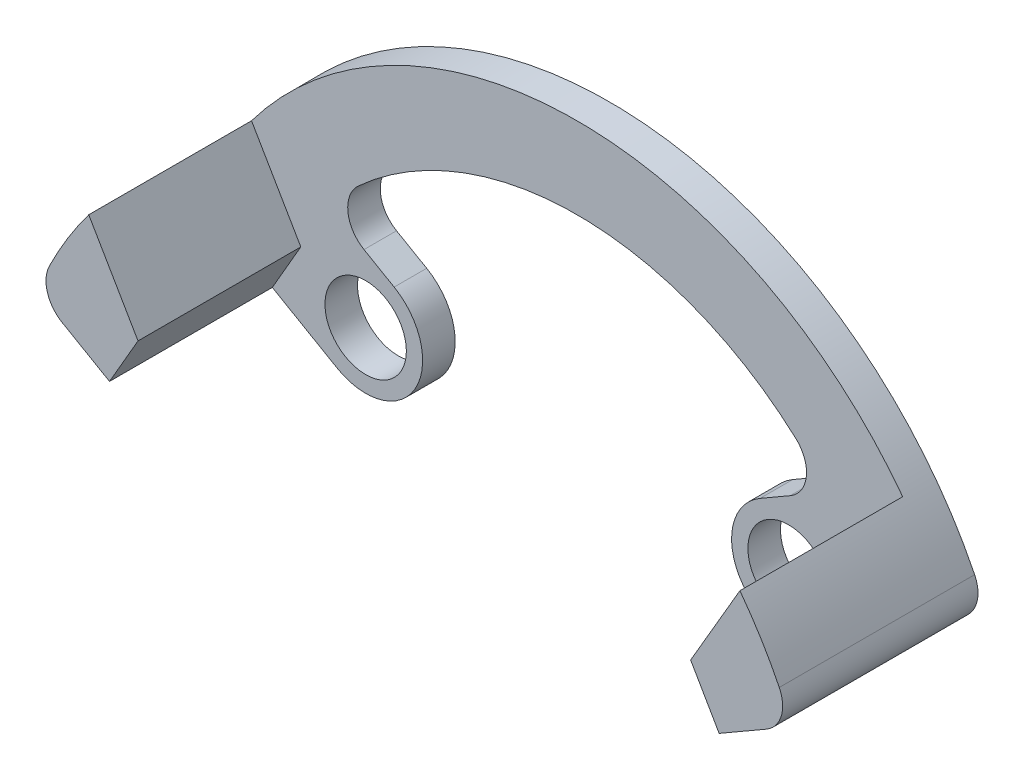
ISO-10303-21;
HEADER;
FILE_DESCRIPTION(('STEP AP214'),'2;1');
FILE_NAME('part.step','',(''),(''),'','','');
FILE_SCHEMA(('AUTOMOTIVE_DESIGN { 1 0 10303 214 1 1 1 1 }'));
ENDSEC;
DATA;
#1=APPLICATION_CONTEXT('core data for automotive mechanical design processes');
#2=APPLICATION_PROTOCOL_DEFINITION('international standard','automotive_design',2000,#1);
#3=PRODUCT_CONTEXT('',#1,'mechanical');
#4=PRODUCT('Part','Part','',(#3));
#5=PRODUCT_RELATED_PRODUCT_CATEGORY('part','',(#4));
#6=PRODUCT_DEFINITION_FORMATION('','',#4);
#7=PRODUCT_DEFINITION_CONTEXT('part definition',#1,'design');
#8=PRODUCT_DEFINITION('design','',#6,#7);
#9=PRODUCT_DEFINITION_SHAPE('','',#8);
#10=(LENGTH_UNIT() NAMED_UNIT(*) SI_UNIT(.MILLI.,.METRE.));
#11=(NAMED_UNIT(*) PLANE_ANGLE_UNIT() SI_UNIT($,.RADIAN.));
#12=(NAMED_UNIT(*) SI_UNIT($,.STERADIAN.) SOLID_ANGLE_UNIT());
#13=UNCERTAINTY_MEASURE_WITH_UNIT(LENGTH_MEASURE(1.E-05),#10,'distance_accuracy_value','');
#14=(GEOMETRIC_REPRESENTATION_CONTEXT(3) GLOBAL_UNCERTAINTY_ASSIGNED_CONTEXT((#13)) GLOBAL_UNIT_ASSIGNED_CONTEXT((#10,
#11,#12)) REPRESENTATION_CONTEXT('',''));
#15=CARTESIAN_POINT('',(0.,0.,0.));
#16=DIRECTION('',(0.,0.,1.));
#17=DIRECTION('',(1.,0.,0.));
#18=AXIS2_PLACEMENT_3D('',#15,#16,#17);
#19=CARTESIAN_POINT('',(-6.495,3.75032998548128,0.));
#20=DIRECTION('',(0.,0.,1.));
#21=DIRECTION('',(1.,0.,0.));
#22=AXIS2_PLACEMENT_3D('',#19,#20,#21);
#23=PLANE('',#22);
#24=CARTESIAN_POINT('',(-6.495,3.75032998548128,0.));
#25=DIRECTION('',(0.,0.,1.));
#26=DIRECTION('',(1.,0.,0.));
#27=AXIS2_PLACEMENT_3D('',#24,#25,#26);
#28=CIRCLE('',#27,1.25);
#29=CARTESIAN_POINT('',(-5.245,3.75032998548128,0.));
#30=VERTEX_POINT('',#29);
#31=EDGE_CURVE('E225',#30,#30,#28,.T.);
#32=ORIENTED_EDGE('',*,*,#31,.F.);
#33=EDGE_LOOP('',(#32));
#34=FACE_BOUND('',#33,.T.);
#35=CARTESIAN_POINT('',(6.495,3.75032998548128,0.));
#36=DIRECTION('',(0.,0.,1.));
#37=DIRECTION('',(1.,0.,0.));
#38=AXIS2_PLACEMENT_3D('',#35,#36,#37);
#39=CIRCLE('',#38,1.25);
#40=CARTESIAN_POINT('',(7.745,3.75032998548128,0.));
#41=VERTEX_POINT('',#40);
#42=EDGE_CURVE('E229',#41,#41,#39,.T.);
#43=ORIENTED_EDGE('',*,*,#42,.F.);
#44=EDGE_LOOP('',(#43));
#45=FACE_BOUND('',#44,.T.);
#46=DIRECTION('',(-0.50304415668639,0.86426071091059,0.));
#47=VECTOR('',#46,1.);
#48=CARTESIAN_POINT('',(-8.48685842870422,4.90032998548127,0.));
#49=LINE('',#48,#47);
#50=CARTESIAN_POINT('',(-8.48685842870422,4.90032998548127,0.));
#51=VERTEX_POINT('',#50);
#52=CARTESIAN_POINT('',(-10.,7.5,0.));
#53=VERTEX_POINT('',#52);
#54=EDGE_CURVE('E51',#51,#53,#49,.T.);
#55=ORIENTED_EDGE('',*,*,#54,.F.);
#56=DIRECTION('',(0.499999999999999,0.866025403784439,0.));
#57=VECTOR('',#56,1.);
#58=CARTESIAN_POINT('',(-9.36185842870421,3.38478552885851,0.));
#59=LINE('',#58,#57);
#60=CARTESIAN_POINT('',(-9.36185842870421,3.3847855288585,0.));
#61=VERTEX_POINT('',#60);
#62=EDGE_CURVE('E55',#61,#51,#59,.T.);
#63=ORIENTED_EDGE('',*,*,#62,.F.);
#64=DIRECTION('',(0.86602540378444,-0.499999999999998,0.));
#65=VECTOR('',#64,1.);
#66=CARTESIAN_POINT('',(-10.8129206466702,4.22255669101206,0.));
#67=LINE('',#66,#65);
#68=CARTESIAN_POINT('',(-7.37,2.23478552885851,0.));
#69=VERTEX_POINT('',#68);
#70=EDGE_CURVE('E242',#61,#69,#67,.T.);
#71=ORIENTED_EDGE('',*,*,#70,.T.);
#72=CARTESIAN_POINT('',(-6.495,3.75032998548128,0.));
#73=DIRECTION('',(0.,0.,1.));
#74=DIRECTION('',(1.,0.,0.));
#75=AXIS2_PLACEMENT_3D('',#72,#73,#74);
#76=CIRCLE('',#75,1.75);
#77=CARTESIAN_POINT('',(-5.62,5.26587444210405,0.));
#78=VERTEX_POINT('',#77);
#79=EDGE_CURVE('E235',#69,#78,#76,.T.);
#80=ORIENTED_EDGE('',*,*,#79,.T.);
#81=DIRECTION('',(-0.866025403784439,0.499999999999999,0.));
#82=VECTOR('',#81,1.);
#83=CARTESIAN_POINT('',(-5.62,5.26587444210405,0.));
#84=LINE('',#83,#82);
#85=CARTESIAN_POINT('',(-6.54616738142823,5.80059742908628,0.));
#86=VERTEX_POINT('',#85);
#87=EDGE_CURVE('E274',#78,#86,#84,.T.);
#88=ORIENTED_EDGE('',*,*,#87,.T.);
#89=CARTESIAN_POINT('',(-6.04616738142823,6.66662283287072,0.));
#90=DIRECTION('',(0.,0.,-1.));
#91=DIRECTION('',(-1.,0.,0.));
#92=AXIS2_PLACEMENT_3D('',#89,#90,#91);
#93=CIRCLE('',#92,1.);
#94=CARTESIAN_POINT('',(-6.71796375714248,7.40735870318969,0.));
#95=VERTEX_POINT('',#94);
#96=EDGE_CURVE('E277',#86,#95,#93,.T.);
#97=ORIENTED_EDGE('',*,*,#96,.T.);
#98=CARTESIAN_POINT('',(0.,0.,0.));
#99=DIRECTION('',(0.,0.,-1.));
#100=DIRECTION('',(1.,0.,0.));
#101=AXIS2_PLACEMENT_3D('',#98,#99,#100);
#102=CIRCLE('',#101,10.);
#103=CARTESIAN_POINT('',(6.71796375714248,7.40735870318969,0.));
#104=VERTEX_POINT('',#103);
#105=EDGE_CURVE('E280',#95,#104,#102,.T.);
#106=ORIENTED_EDGE('',*,*,#105,.T.);
#107=CARTESIAN_POINT('',(6.04616738142823,6.66662283287072,0.));
#108=DIRECTION('',(0.,0.,-1.));
#109=DIRECTION('',(1.,0.,0.));
#110=AXIS2_PLACEMENT_3D('',#107,#108,#109);
#111=CIRCLE('',#110,1.);
#112=CARTESIAN_POINT('',(6.54616738142823,5.80059742908628,0.));
#113=VERTEX_POINT('',#112);
#114=EDGE_CURVE('E283',#104,#113,#111,.T.);
#115=ORIENTED_EDGE('',*,*,#114,.T.);
#116=DIRECTION('',(-0.86602540378444,-0.499999999999997,0.));
#117=VECTOR('',#116,1.);
#118=CARTESIAN_POINT('',(5.62,5.26587444210405,0.));
#119=LINE('',#118,#117);
#120=CARTESIAN_POINT('',(5.62,5.26587444210405,0.));
#121=VERTEX_POINT('',#120);
#122=EDGE_CURVE('E286',#113,#121,#119,.T.);
#123=ORIENTED_EDGE('',*,*,#122,.T.);
#124=CARTESIAN_POINT('',(6.495,3.75032998548128,0.));
#125=DIRECTION('',(0.,0.,1.));
#126=DIRECTION('',(1.,0.,0.));
#127=AXIS2_PLACEMENT_3D('',#124,#125,#126);
#128=CIRCLE('',#127,1.75);
#129=CARTESIAN_POINT('',(7.37,2.23478552885851,0.));
#130=VERTEX_POINT('',#129);
#131=EDGE_CURVE('E289',#121,#130,#128,.T.);
#132=ORIENTED_EDGE('',*,*,#131,.T.);
#133=DIRECTION('',(0.86602540378444,0.499999999999998,0.));
#134=VECTOR('',#133,1.);
#135=CARTESIAN_POINT('',(10.8129206466702,4.22255669101206,0.));
#136=LINE('',#135,#134);
#137=CARTESIAN_POINT('',(9.36185842870421,3.38478552885851,0.));
#138=VERTEX_POINT('',#137);
#139=EDGE_CURVE('E292',#130,#138,#136,.T.);
#140=ORIENTED_EDGE('',*,*,#139,.T.);
#141=DIRECTION('',(0.499999999999998,-0.86602540378444,0.));
#142=VECTOR('',#141,1.);
#143=CARTESIAN_POINT('',(9.36185842870421,3.38478552885851,0.));
#144=LINE('',#143,#142);
#145=CARTESIAN_POINT('',(8.48685842870422,4.90032998548128,0.));
#146=VERTEX_POINT('',#145);
#147=EDGE_CURVE('E203',#146,#138,#144,.T.);
#148=ORIENTED_EDGE('',*,*,#147,.F.);
#149=DIRECTION('',(-0.503044156686389,-0.864260710910591,0.));
#150=VECTOR('',#149,1.);
#151=CARTESIAN_POINT('',(8.48685842870422,4.90032998548128,0.));
#152=LINE('',#151,#150);
#153=CARTESIAN_POINT('',(10.,7.5,0.));
#154=VERTEX_POINT('',#153);
#155=EDGE_CURVE('E198',#154,#146,#152,.T.);
#156=ORIENTED_EDGE('',*,*,#155,.F.);
#157=CARTESIAN_POINT('',(0.,0.,0.));
#158=DIRECTION('',(0.,0.,1.));
#159=DIRECTION('',(1.,0.,0.));
#160=AXIS2_PLACEMENT_3D('',#157,#158,#159);
#161=CIRCLE('',#160,12.5);
#162=EDGE_CURVE('E294',#154,#53,#161,.T.);
#163=ORIENTED_EDGE('',*,*,#162,.T.);
#164=EDGE_LOOP('',(#55,#63,#71,#80,#88,#97,#106,#115,#123,#132,#140,#148,#156,#163));
#165=FACE_BOUND('',#164,.T.);
#166=ADVANCED_FACE('F34',(#34,#45,#165),#23,.T.);
#167=CARTESIAN_POINT('',(-6.495,3.75032998548128,-1.));
#168=DIRECTION('',(0.,0.,1.));
#169=DIRECTION('',(1.,0.,0.));
#170=AXIS2_PLACEMENT_3D('',#167,#168,#169);
#171=CYLINDRICAL_SURFACE('',#170,1.75);
#172=ORIENTED_EDGE('',*,*,#79,.F.);
#173=DIRECTION('',(0.,0.,1.));
#174=VECTOR('',#173,1.);
#175=CARTESIAN_POINT('',(-7.37,2.23478552885851,-1.));
#176=LINE('',#175,#174);
#177=CARTESIAN_POINT('',(-7.37,2.23478552885851,-1.));
#178=VERTEX_POINT('',#177);
#179=EDGE_CURVE('E11',#178,#69,#176,.T.);
#180=ORIENTED_EDGE('',*,*,#179,.F.);
#181=CARTESIAN_POINT('',(-6.495,3.75032998548128,-1.));
#182=DIRECTION('',(0.,0.,1.));
#183=DIRECTION('',(1.,0.,0.));
#184=AXIS2_PLACEMENT_3D('',#181,#182,#183);
#185=CIRCLE('',#184,1.75);
#186=CARTESIAN_POINT('',(-5.62,5.26587444210405,-1.));
#187=VERTEX_POINT('',#186);
#188=EDGE_CURVE('E238',#178,#187,#185,.T.);
#189=ORIENTED_EDGE('',*,*,#188,.T.);
#190=DIRECTION('',(0.,0.,1.));
#191=VECTOR('',#190,1.);
#192=CARTESIAN_POINT('',(-5.62,5.26587444210405,-1.));
#193=LINE('',#192,#191);
#194=EDGE_CURVE('E38',#187,#78,#193,.T.);
#195=ORIENTED_EDGE('',*,*,#194,.T.);
#196=EDGE_LOOP('',(#172,#180,#189,#195));
#197=FACE_BOUND('',#196,.T.);
#198=ADVANCED_FACE('F36',(#197),#171,.T.);
#199=CARTESIAN_POINT('',(-10.8129206466702,4.22255669101206,-1.));
#200=DIRECTION('',(-0.499999999999998,-0.86602540378444,0.));
#201=DIRECTION('',(0.86602540378444,-0.499999999999998,0.));
#202=AXIS2_PLACEMENT_3D('',#199,#200,#201);
#203=PLANE('',#202);
#204=ORIENTED_EDGE('',*,*,#70,.F.);
#205=DIRECTION('',(0.,0.,-1.));
#206=VECTOR('',#205,1.);
#207=CARTESIAN_POINT('',(-9.36185842870421,3.38478552885851,5.));
#208=LINE('',#207,#206);
#209=CARTESIAN_POINT('',(-9.36185842870421,3.38478552885851,5.));
#210=VERTEX_POINT('',#209);
#211=EDGE_CURVE('E174',#210,#61,#208,.T.);
#212=ORIENTED_EDGE('',*,*,#211,.F.);
#213=DIRECTION('',(0.866025403784439,-0.499999999999999,0.));
#214=VECTOR('',#213,1.);
#215=CARTESIAN_POINT('',(-9.36185842870421,3.38478552885851,5.));
#216=LINE('',#215,#214);
#217=CARTESIAN_POINT('',(-10.8129206466702,4.22255669101206,5.));
#218=VERTEX_POINT('',#217);
#219=EDGE_CURVE('E171',#218,#210,#216,.T.);
#220=ORIENTED_EDGE('',*,*,#219,.F.);
#221=DIRECTION('',(0.,0.,1.));
#222=VECTOR('',#221,1.);
#223=CARTESIAN_POINT('',(-10.8129206466702,4.22255669101206,-1.));
#224=LINE('',#223,#222);
#225=CARTESIAN_POINT('',(-10.8129206466702,4.22255669101206,-1.));
#226=VERTEX_POINT('',#225);
#227=EDGE_CURVE('E43',#226,#218,#224,.T.);
#228=ORIENTED_EDGE('',*,*,#227,.F.);
#229=DIRECTION('',(0.86602540378444,-0.499999999999998,0.));
#230=VECTOR('',#229,1.);
#231=CARTESIAN_POINT('',(-10.8129206466702,4.22255669101206,-1.));
#232=LINE('',#231,#230);
#233=EDGE_CURVE('E270',#226,#178,#232,.T.);
#234=ORIENTED_EDGE('',*,*,#233,.T.);
#235=ORIENTED_EDGE('',*,*,#179,.T.);
#236=EDGE_LOOP('',(#204,#212,#220,#228,#234,#235));
#237=FACE_BOUND('',#236,.T.);
#238=ADVANCED_FACE('F172',(#237),#203,.T.);
#239=CARTESIAN_POINT('',(-10.3129206466702,5.0885820947965,-1.));
#240=DIRECTION('',(0.,0.,1.));
#241=DIRECTION('',(1.,0.,0.));
#242=AXIS2_PLACEMENT_3D('',#239,#240,#241);
#243=CYLINDRICAL_SURFACE('',#242,1.);
#244=ORIENTED_EDGE('',*,*,#227,.T.);
#245=CARTESIAN_POINT('',(-10.3129206466702,5.0885820947965,5.));
#246=DIRECTION('',(0.,0.,1.));
#247=DIRECTION('',(-1.,0.,0.));
#248=AXIS2_PLACEMENT_3D('',#245,#246,#247);
#249=CIRCLE('',#248,0.999999999999999);
#250=CARTESIAN_POINT('',(-11.2096963550763,5.53106749434402,5.));
#251=VERTEX_POINT('',#250);
#252=EDGE_CURVE('E162',#251,#218,#249,.T.);
#253=ORIENTED_EDGE('',*,*,#252,.F.);
#254=DIRECTION('',(0.,0.,1.));
#255=VECTOR('',#254,1.);
#256=CARTESIAN_POINT('',(-11.2096963550763,5.53106749434402,-1.));
#257=LINE('',#256,#255);
#258=CARTESIAN_POINT('',(-11.2096963550763,5.53106749434402,-1.));
#259=VERTEX_POINT('',#258);
#260=EDGE_CURVE('E168',#259,#251,#257,.T.);
#261=ORIENTED_EDGE('',*,*,#260,.F.);
#262=CARTESIAN_POINT('',(-10.3129206466702,5.0885820947965,-1.));
#263=DIRECTION('',(0.,0.,1.));
#264=DIRECTION('',(-1.,0.,0.));
#265=AXIS2_PLACEMENT_3D('',#262,#263,#264);
#266=CIRCLE('',#265,1.);
#267=EDGE_CURVE('E164',#259,#226,#266,.T.);
#268=ORIENTED_EDGE('',*,*,#267,.T.);
#269=EDGE_LOOP('',(#244,#253,#261,#268));
#270=FACE_BOUND('',#269,.T.);
#271=ADVANCED_FACE('F160',(#270),#243,.T.);
#272=CARTESIAN_POINT('',(0.,0.,-1.));
#273=DIRECTION('',(0.,0.,1.));
#274=DIRECTION('',(1.,0.,0.));
#275=AXIS2_PLACEMENT_3D('',#272,#273,#274);
#276=CYLINDRICAL_SURFACE('',#275,12.5);
#277=ORIENTED_EDGE('',*,*,#162,.F.);
#278=DIRECTION('',(0.,0.,-1.));
#279=VECTOR('',#278,1.);
#280=CARTESIAN_POINT('',(10.,7.5,5.));
#281=LINE('',#280,#279);
#282=CARTESIAN_POINT('',(10.,7.5,5.));
#283=VERTEX_POINT('',#282);
#284=EDGE_CURVE('E222',#283,#154,#281,.T.);
#285=ORIENTED_EDGE('',*,*,#284,.F.);
#286=CARTESIAN_POINT('',(0.,0.,5.));
#287=DIRECTION('',(0.,0.,1.));
#288=DIRECTION('',(1.,0.,0.));
#289=AXIS2_PLACEMENT_3D('',#286,#287,#288);
#290=CIRCLE('',#289,12.5);
#291=CARTESIAN_POINT('',(11.2096963550763,5.53106749434402,5.));
#292=VERTEX_POINT('',#291);
#293=EDGE_CURVE('E206',#292,#283,#290,.T.);
#294=ORIENTED_EDGE('',*,*,#293,.F.);
#295=DIRECTION('',(0.,0.,1.));
#296=VECTOR('',#295,1.);
#297=CARTESIAN_POINT('',(11.2096963550763,5.53106749434402,-1.));
#298=LINE('',#297,#296);
#299=CARTESIAN_POINT('',(11.2096963550763,5.53106749434402,-1.));
#300=VERTEX_POINT('',#299);
#301=EDGE_CURVE('E298',#300,#292,#298,.T.);
#302=ORIENTED_EDGE('',*,*,#301,.F.);
#303=CARTESIAN_POINT('',(0.,0.,-1.));
#304=DIRECTION('',(0.,0.,1.));
#305=DIRECTION('',(1.,0.,0.));
#306=AXIS2_PLACEMENT_3D('',#303,#304,#305);
#307=CIRCLE('',#306,12.5);
#308=EDGE_CURVE('E266',#300,#259,#307,.T.);
#309=ORIENTED_EDGE('',*,*,#308,.T.);
#310=ORIENTED_EDGE('',*,*,#260,.T.);
#311=CARTESIAN_POINT('',(0.,0.,5.));
#312=DIRECTION('',(0.,0.,1.));
#313=DIRECTION('',(-1.,0.,0.));
#314=AXIS2_PLACEMENT_3D('',#311,#312,#313);
#315=CIRCLE('',#314,12.5);
#316=CARTESIAN_POINT('',(-10.,7.5,5.));
#317=VERTEX_POINT('',#316);
#318=EDGE_CURVE('E182',#317,#251,#315,.T.);
#319=ORIENTED_EDGE('',*,*,#318,.F.);
#320=DIRECTION('',(0.,0.,-1.));
#321=VECTOR('',#320,1.);
#322=CARTESIAN_POINT('',(-10.,7.5,5.));
#323=LINE('',#322,#321);
#324=EDGE_CURVE('E190',#317,#53,#323,.T.);
#325=ORIENTED_EDGE('',*,*,#324,.T.);
#326=EDGE_LOOP('',(#277,#285,#294,#302,#309,#310,#319,#325));
#327=FACE_BOUND('',#326,.T.);
#328=ADVANCED_FACE('F358',(#327),#276,.T.);
#329=CARTESIAN_POINT('',(10.3129206466702,5.0885820947965,-1.));
#330=DIRECTION('',(0.,0.,1.));
#331=DIRECTION('',(1.,0.,0.));
#332=AXIS2_PLACEMENT_3D('',#329,#330,#331);
#333=CYLINDRICAL_SURFACE('',#332,1.);
#334=ORIENTED_EDGE('',*,*,#301,.T.);
#335=CARTESIAN_POINT('',(10.3129206466702,5.0885820947965,5.));
#336=DIRECTION('',(0.,0.,1.));
#337=DIRECTION('',(1.,0.,0.));
#338=AXIS2_PLACEMENT_3D('',#335,#336,#337);
#339=CIRCLE('',#338,0.999999999999999);
#340=CARTESIAN_POINT('',(10.8129206466702,4.22255669101206,5.));
#341=VERTEX_POINT('',#340);
#342=EDGE_CURVE('E202',#341,#292,#339,.T.);
#343=ORIENTED_EDGE('',*,*,#342,.F.);
#344=DIRECTION('',(0.,0.,1.));
#345=VECTOR('',#344,1.);
#346=CARTESIAN_POINT('',(10.8129206466702,4.22255669101206,-1.));
#347=LINE('',#346,#345);
#348=CARTESIAN_POINT('',(10.8129206466702,4.22255669101206,-1.));
#349=VERTEX_POINT('',#348);
#350=EDGE_CURVE('E300',#349,#341,#347,.T.);
#351=ORIENTED_EDGE('',*,*,#350,.F.);
#352=CARTESIAN_POINT('',(10.3129206466702,5.0885820947965,-1.));
#353=DIRECTION('',(0.,0.,1.));
#354=DIRECTION('',(1.,0.,0.));
#355=AXIS2_PLACEMENT_3D('',#352,#353,#354);
#356=CIRCLE('',#355,1.);
#357=EDGE_CURVE('E263',#349,#300,#356,.T.);
#358=ORIENTED_EDGE('',*,*,#357,.T.);
#359=EDGE_LOOP('',(#334,#343,#351,#358));
#360=FACE_BOUND('',#359,.T.);
#361=ADVANCED_FACE('F393',(#360),#333,.T.);
#362=CARTESIAN_POINT('',(10.8129206466702,4.22255669101206,-1.));
#363=DIRECTION('',(0.499999999999998,-0.86602540378444,0.));
#364=DIRECTION('',(0.86602540378444,0.499999999999998,0.));
#365=AXIS2_PLACEMENT_3D('',#362,#363,#364);
#366=PLANE('',#365);
#367=ORIENTED_EDGE('',*,*,#139,.F.);
#368=DIRECTION('',(0.,0.,1.));
#369=VECTOR('',#368,1.);
#370=CARTESIAN_POINT('',(7.37,2.23478552885851,-1.));
#371=LINE('',#370,#369);
#372=CARTESIAN_POINT('',(7.37,2.23478552885851,-1.));
#373=VERTEX_POINT('',#372);
#374=EDGE_CURVE('E302',#373,#130,#371,.T.);
#375=ORIENTED_EDGE('',*,*,#374,.F.);
#376=DIRECTION('',(0.86602540378444,0.499999999999998,0.));
#377=VECTOR('',#376,1.);
#378=CARTESIAN_POINT('',(10.8129206466702,4.22255669101206,-1.));
#379=LINE('',#378,#377);
#380=EDGE_CURVE('E260',#373,#349,#379,.T.);
#381=ORIENTED_EDGE('',*,*,#380,.T.);
#382=ORIENTED_EDGE('',*,*,#350,.T.);
#383=DIRECTION('',(0.866025403784439,0.499999999999999,0.));
#384=VECTOR('',#383,1.);
#385=CARTESIAN_POINT('',(9.36185842870421,3.38478552885851,5.));
#386=LINE('',#385,#384);
#387=CARTESIAN_POINT('',(9.36185842870421,3.38478552885851,5.));
#388=VERTEX_POINT('',#387);
#389=EDGE_CURVE('E199',#388,#341,#386,.T.);
#390=ORIENTED_EDGE('',*,*,#389,.F.);
#391=DIRECTION('',(0.,0.,-1.));
#392=VECTOR('',#391,1.);
#393=CARTESIAN_POINT('',(9.36185842870421,3.38478552885851,5.));
#394=LINE('',#393,#392);
#395=EDGE_CURVE('E212',#388,#138,#394,.T.);
#396=ORIENTED_EDGE('',*,*,#395,.T.);
#397=EDGE_LOOP('',(#367,#375,#381,#382,#390,#396));
#398=FACE_BOUND('',#397,.T.);
#399=ADVANCED_FACE('F344',(#398),#366,.T.);
#400=CARTESIAN_POINT('',(6.495,3.75032998548128,-1.));
#401=DIRECTION('',(0.,0.,1.));
#402=DIRECTION('',(1.,0.,0.));
#403=AXIS2_PLACEMENT_3D('',#400,#401,#402);
#404=CYLINDRICAL_SURFACE('',#403,1.75);
#405=ORIENTED_EDGE('',*,*,#131,.F.);
#406=DIRECTION('',(0.,0.,1.));
#407=VECTOR('',#406,1.);
#408=CARTESIAN_POINT('',(5.62,5.26587444210405,-1.));
#409=LINE('',#408,#407);
#410=CARTESIAN_POINT('',(5.62,5.26587444210405,-1.));
#411=VERTEX_POINT('',#410);
#412=EDGE_CURVE('E304',#411,#121,#409,.T.);
#413=ORIENTED_EDGE('',*,*,#412,.F.);
#414=CARTESIAN_POINT('',(6.495,3.75032998548128,-1.));
#415=DIRECTION('',(0.,0.,1.));
#416=DIRECTION('',(1.,0.,0.));
#417=AXIS2_PLACEMENT_3D('',#414,#415,#416);
#418=CIRCLE('',#417,1.75);
#419=EDGE_CURVE('E257',#411,#373,#418,.T.);
#420=ORIENTED_EDGE('',*,*,#419,.T.);
#421=ORIENTED_EDGE('',*,*,#374,.T.);
#422=EDGE_LOOP('',(#405,#413,#420,#421));
#423=FACE_BOUND('',#422,.T.);
#424=ADVANCED_FACE('F340',(#423),#404,.T.);
#425=CARTESIAN_POINT('',(5.62,5.26587444210405,-1.));
#426=DIRECTION('',(-0.499999999999997,0.86602540378444,0.));
#427=DIRECTION('',(-0.86602540378444,-0.499999999999997,0.));
#428=AXIS2_PLACEMENT_3D('',#425,#426,#427);
#429=PLANE('',#428);
#430=ORIENTED_EDGE('',*,*,#122,.F.);
#431=DIRECTION('',(0.,0.,1.));
#432=VECTOR('',#431,1.);
#433=CARTESIAN_POINT('',(6.54616738142823,5.80059742908628,-1.));
#434=LINE('',#433,#432);
#435=CARTESIAN_POINT('',(6.54616738142823,5.80059742908628,-1.));
#436=VERTEX_POINT('',#435);
#437=EDGE_CURVE('E306',#436,#113,#434,.T.);
#438=ORIENTED_EDGE('',*,*,#437,.F.);
#439=DIRECTION('',(-0.86602540378444,-0.499999999999997,0.));
#440=VECTOR('',#439,1.);
#441=CARTESIAN_POINT('',(5.62,5.26587444210405,-1.));
#442=LINE('',#441,#440);
#443=EDGE_CURVE('E254',#436,#411,#442,.T.);
#444=ORIENTED_EDGE('',*,*,#443,.T.);
#445=ORIENTED_EDGE('',*,*,#412,.T.);
#446=EDGE_LOOP('',(#430,#438,#444,#445));
#447=FACE_BOUND('',#446,.T.);
#448=ADVANCED_FACE('F336',(#447),#429,.T.);
#449=CARTESIAN_POINT('',(6.04616738142823,6.66662283287072,-1.));
#450=DIRECTION('',(0.,0.,1.));
#451=DIRECTION('',(1.,0.,0.));
#452=AXIS2_PLACEMENT_3D('',#449,#450,#451);
#453=CYLINDRICAL_SURFACE('',#452,1.);
#454=ORIENTED_EDGE('',*,*,#114,.F.);
#455=DIRECTION('',(0.,0.,1.));
#456=VECTOR('',#455,1.);
#457=CARTESIAN_POINT('',(6.71796375714248,7.40735870318969,-1.));
#458=LINE('',#457,#456);
#459=CARTESIAN_POINT('',(6.71796375714248,7.40735870318969,-1.));
#460=VERTEX_POINT('',#459);
#461=EDGE_CURVE('E308',#460,#104,#458,.T.);
#462=ORIENTED_EDGE('',*,*,#461,.F.);
#463=CARTESIAN_POINT('',(6.04616738142823,6.66662283287072,-1.));
#464=DIRECTION('',(0.,0.,-1.));
#465=DIRECTION('',(1.,0.,0.));
#466=AXIS2_PLACEMENT_3D('',#463,#464,#465);
#467=CIRCLE('',#466,1.);
#468=EDGE_CURVE('E251',#460,#436,#467,.T.);
#469=ORIENTED_EDGE('',*,*,#468,.T.);
#470=ORIENTED_EDGE('',*,*,#437,.T.);
#471=EDGE_LOOP('',(#454,#462,#469,#470));
#472=FACE_BOUND('',#471,.T.);
#473=ADVANCED_FACE('F332',(#472),#453,.F.);
#474=CARTESIAN_POINT('',(0.,0.,-1.));
#475=DIRECTION('',(0.,0.,1.));
#476=DIRECTION('',(1.,0.,0.));
#477=AXIS2_PLACEMENT_3D('',#474,#475,#476);
#478=CYLINDRICAL_SURFACE('',#477,10.);
#479=ORIENTED_EDGE('',*,*,#105,.F.);
#480=DIRECTION('',(0.,0.,1.));
#481=VECTOR('',#480,1.);
#482=CARTESIAN_POINT('',(-6.71796375714248,7.40735870318969,-1.));
#483=LINE('',#482,#481);
#484=CARTESIAN_POINT('',(-6.71796375714248,7.40735870318969,-1.));
#485=VERTEX_POINT('',#484);
#486=EDGE_CURVE('E310',#485,#95,#483,.T.);
#487=ORIENTED_EDGE('',*,*,#486,.F.);
#488=CARTESIAN_POINT('',(0.,0.,-1.));
#489=DIRECTION('',(0.,0.,-1.));
#490=DIRECTION('',(1.,0.,0.));
#491=AXIS2_PLACEMENT_3D('',#488,#489,#490);
#492=CIRCLE('',#491,10.);
#493=EDGE_CURVE('E248',#485,#460,#492,.T.);
#494=ORIENTED_EDGE('',*,*,#493,.T.);
#495=ORIENTED_EDGE('',*,*,#461,.T.);
#496=EDGE_LOOP('',(#479,#487,#494,#495));
#497=FACE_BOUND('',#496,.T.);
#498=ADVANCED_FACE('F330',(#497),#478,.F.);
#499=CARTESIAN_POINT('',(-6.04616738142823,6.66662283287072,-1.));
#500=DIRECTION('',(0.,0.,1.));
#501=DIRECTION('',(1.,0.,0.));
#502=AXIS2_PLACEMENT_3D('',#499,#500,#501);
#503=CYLINDRICAL_SURFACE('',#502,1.);
#504=ORIENTED_EDGE('',*,*,#96,.F.);
#505=DIRECTION('',(0.,0.,1.));
#506=VECTOR('',#505,1.);
#507=CARTESIAN_POINT('',(-6.54616738142823,5.80059742908628,-1.));
#508=LINE('',#507,#506);
#509=CARTESIAN_POINT('',(-6.54616738142823,5.80059742908628,-1.));
#510=VERTEX_POINT('',#509);
#511=EDGE_CURVE('E311',#510,#86,#508,.T.);
#512=ORIENTED_EDGE('',*,*,#511,.F.);
#513=CARTESIAN_POINT('',(-6.04616738142823,6.66662283287072,-1.));
#514=DIRECTION('',(0.,0.,-1.));
#515=DIRECTION('',(-1.,0.,0.));
#516=AXIS2_PLACEMENT_3D('',#513,#514,#515);
#517=CIRCLE('',#516,1.);
#518=EDGE_CURVE('E245',#510,#485,#517,.T.);
#519=ORIENTED_EDGE('',*,*,#518,.T.);
#520=ORIENTED_EDGE('',*,*,#486,.T.);
#521=EDGE_LOOP('',(#504,#512,#519,#520));
#522=FACE_BOUND('',#521,.T.);
#523=ADVANCED_FACE('F326',(#522),#503,.F.);
#524=CARTESIAN_POINT('',(-5.62,5.26587444210405,-1.));
#525=DIRECTION('',(0.499999999999999,0.866025403784439,0.));
#526=DIRECTION('',(-0.866025403784439,0.499999999999999,0.));
#527=AXIS2_PLACEMENT_3D('',#524,#525,#526);
#528=PLANE('',#527);
#529=ORIENTED_EDGE('',*,*,#87,.F.);
#530=ORIENTED_EDGE('',*,*,#194,.F.);
#531=DIRECTION('',(-0.866025403784439,0.499999999999999,0.));
#532=VECTOR('',#531,1.);
#533=CARTESIAN_POINT('',(-5.62,5.26587444210405,-1.));
#534=LINE('',#533,#532);
#535=EDGE_CURVE('E241',#187,#510,#534,.T.);
#536=ORIENTED_EDGE('',*,*,#535,.T.);
#537=ORIENTED_EDGE('',*,*,#511,.T.);
#538=EDGE_LOOP('',(#529,#530,#536,#537));
#539=FACE_BOUND('',#538,.T.);
#540=ADVANCED_FACE('F319',(#539),#528,.T.);
#541=CARTESIAN_POINT('',(-6.495,3.75032998548128,-1.));
#542=DIRECTION('',(0.,0.,1.));
#543=DIRECTION('',(1.,0.,0.));
#544=AXIS2_PLACEMENT_3D('',#541,#542,#543);
#545=PLANE('',#544);
#546=CARTESIAN_POINT('',(-6.495,3.75032998548128,-1.));
#547=DIRECTION('',(0.,0.,1.));
#548=DIRECTION('',(1.,0.,0.));
#549=AXIS2_PLACEMENT_3D('',#546,#547,#548);
#550=CIRCLE('',#549,1.25);
#551=CARTESIAN_POINT('',(-5.245,3.75032998548128,-1.));
#552=VERTEX_POINT('',#551);
#553=EDGE_CURVE('E226',#552,#552,#550,.T.);
#554=ORIENTED_EDGE('',*,*,#553,.T.);
#555=EDGE_LOOP('',(#554));
#556=FACE_BOUND('',#555,.T.);
#557=CARTESIAN_POINT('',(6.495,3.75032998548128,-1.));
#558=DIRECTION('',(0.,0.,1.));
#559=DIRECTION('',(1.,0.,0.));
#560=AXIS2_PLACEMENT_3D('',#557,#558,#559);
#561=CIRCLE('',#560,1.25);
#562=CARTESIAN_POINT('',(7.745,3.75032998548128,-1.));
#563=VERTEX_POINT('',#562);
#564=EDGE_CURVE('E232',#563,#563,#561,.T.);
#565=ORIENTED_EDGE('',*,*,#564,.T.);
#566=EDGE_LOOP('',(#565));
#567=FACE_BOUND('',#566,.T.);
#568=ORIENTED_EDGE('',*,*,#188,.F.);
#569=ORIENTED_EDGE('',*,*,#233,.F.);
#570=ORIENTED_EDGE('',*,*,#267,.F.);
#571=ORIENTED_EDGE('',*,*,#308,.F.);
#572=ORIENTED_EDGE('',*,*,#357,.F.);
#573=ORIENTED_EDGE('',*,*,#380,.F.);
#574=ORIENTED_EDGE('',*,*,#419,.F.);
#575=ORIENTED_EDGE('',*,*,#443,.F.);
#576=ORIENTED_EDGE('',*,*,#468,.F.);
#577=ORIENTED_EDGE('',*,*,#493,.F.);
#578=ORIENTED_EDGE('',*,*,#518,.F.);
#579=ORIENTED_EDGE('',*,*,#535,.F.);
#580=EDGE_LOOP('',(#568,#569,#570,#571,#572,#573,#574,#575,#576,#577,#578,#579));
#581=FACE_BOUND('',#580,.T.);
#582=ADVANCED_FACE('F321',(#556,#567,#581),#545,.F.);
#583=CARTESIAN_POINT('',(6.495,3.75032998548128,-1.));
#584=DIRECTION('',(0.,0.,1.));
#585=DIRECTION('',(1.,0.,0.));
#586=AXIS2_PLACEMENT_3D('',#583,#584,#585);
#587=CYLINDRICAL_SURFACE('',#586,1.25);
#588=ORIENTED_EDGE('',*,*,#564,.F.);
#589=EDGE_LOOP('',(#588));
#590=FACE_BOUND('',#589,.T.);
#591=ORIENTED_EDGE('',*,*,#42,.T.);
#592=EDGE_LOOP('',(#591));
#593=FACE_BOUND('',#592,.T.);
#594=ADVANCED_FACE('F412',(#590,#593),#587,.F.);
#595=CARTESIAN_POINT('',(-6.495,3.75032998548128,-1.));
#596=DIRECTION('',(0.,0.,1.));
#597=DIRECTION('',(1.,0.,0.));
#598=AXIS2_PLACEMENT_3D('',#595,#596,#597);
#599=CYLINDRICAL_SURFACE('',#598,1.25);
#600=ORIENTED_EDGE('',*,*,#553,.F.);
#601=EDGE_LOOP('',(#600));
#602=FACE_BOUND('',#601,.T.);
#603=ORIENTED_EDGE('',*,*,#31,.T.);
#604=EDGE_LOOP('',(#603));
#605=FACE_BOUND('',#604,.T.);
#606=ADVANCED_FACE('F417',(#602,#605),#599,.F.);
#607=CARTESIAN_POINT('',(8.48685842870422,4.90032998548128,5.));
#608=DIRECTION('',(0.864260710910591,-0.503044156686389,0.));
#609=DIRECTION('',(0.503044156686389,0.864260710910591,0.));
#610=AXIS2_PLACEMENT_3D('',#607,#608,#609);
#611=PLANE('',#610);
#612=ORIENTED_EDGE('',*,*,#155,.T.);
#613=DIRECTION('',(0.,0.,-1.));
#614=VECTOR('',#613,1.);
#615=CARTESIAN_POINT('',(8.48685842870422,4.90032998548128,5.));
#616=LINE('',#615,#614);
#617=CARTESIAN_POINT('',(8.48685842870422,4.90032998548128,5.));
#618=VERTEX_POINT('',#617);
#619=EDGE_CURVE('E219',#618,#146,#616,.T.);
#620=ORIENTED_EDGE('',*,*,#619,.F.);
#621=DIRECTION('',(-0.503044156686389,-0.864260710910591,0.));
#622=VECTOR('',#621,1.);
#623=CARTESIAN_POINT('',(8.48685842870422,4.90032998548128,5.));
#624=LINE('',#623,#622);
#625=EDGE_CURVE('E208',#283,#618,#624,.T.);
#626=ORIENTED_EDGE('',*,*,#625,.F.);
#627=ORIENTED_EDGE('',*,*,#284,.T.);
#628=EDGE_LOOP('',(#612,#620,#626,#627));
#629=FACE_BOUND('',#628,.T.);
#630=ADVANCED_FACE('F353',(#629),#611,.F.);
#631=CARTESIAN_POINT('',(9.36185842870421,3.38478552885851,5.));
#632=DIRECTION('',(0.86602540378444,0.499999999999998,0.));
#633=DIRECTION('',(-0.499999999999998,0.86602540378444,0.));
#634=AXIS2_PLACEMENT_3D('',#631,#632,#633);
#635=PLANE('',#634);
#636=ORIENTED_EDGE('',*,*,#147,.T.);
#637=ORIENTED_EDGE('',*,*,#395,.F.);
#638=DIRECTION('',(0.499999999999998,-0.86602540378444,0.));
#639=VECTOR('',#638,1.);
#640=CARTESIAN_POINT('',(9.36185842870421,3.38478552885851,5.));
#641=LINE('',#640,#639);
#642=EDGE_CURVE('E210',#618,#388,#641,.T.);
#643=ORIENTED_EDGE('',*,*,#642,.F.);
#644=ORIENTED_EDGE('',*,*,#619,.T.);
#645=EDGE_LOOP('',(#636,#637,#643,#644));
#646=FACE_BOUND('',#645,.T.);
#647=ADVANCED_FACE('F349',(#646),#635,.F.);
#648=CARTESIAN_POINT('',(10.3129206466702,5.0885820947965,5.));
#649=DIRECTION('',(0.,0.,1.));
#650=DIRECTION('',(1.,0.,0.));
#651=AXIS2_PLACEMENT_3D('',#648,#649,#650);
#652=PLANE('',#651);
#653=ORIENTED_EDGE('',*,*,#389,.T.);
#654=ORIENTED_EDGE('',*,*,#342,.T.);
#655=ORIENTED_EDGE('',*,*,#293,.T.);
#656=ORIENTED_EDGE('',*,*,#625,.T.);
#657=ORIENTED_EDGE('',*,*,#642,.T.);
#658=EDGE_LOOP('',(#653,#654,#655,#656,#657));
#659=FACE_BOUND('',#658,.T.);
#660=ADVANCED_FACE('F367',(#659),#652,.T.);
#661=CARTESIAN_POINT('',(-9.36185842870421,3.38478552885851,5.));
#662=DIRECTION('',(-0.866025403784439,0.499999999999999,0.));
#663=DIRECTION('',(-0.499999999999999,-0.866025403784439,0.));
#664=AXIS2_PLACEMENT_3D('',#661,#662,#663);
#665=PLANE('',#664);
#666=ORIENTED_EDGE('',*,*,#62,.T.);
#667=DIRECTION('',(0.,0.,-1.));
#668=VECTOR('',#667,1.);
#669=CARTESIAN_POINT('',(-8.48685842870422,4.90032998548127,5.));
#670=LINE('',#669,#668);
#671=CARTESIAN_POINT('',(-8.48685842870422,4.90032998548127,5.));
#672=VERTEX_POINT('',#671);
#673=EDGE_CURVE('E194',#672,#51,#670,.T.);
#674=ORIENTED_EDGE('',*,*,#673,.F.);
#675=DIRECTION('',(0.499999999999999,0.866025403784439,0.));
#676=VECTOR('',#675,1.);
#677=CARTESIAN_POINT('',(-9.36185842870421,3.38478552885851,5.));
#678=LINE('',#677,#676);
#679=EDGE_CURVE('E177',#210,#672,#678,.T.);
#680=ORIENTED_EDGE('',*,*,#679,.F.);
#681=ORIENTED_EDGE('',*,*,#211,.T.);
#682=EDGE_LOOP('',(#666,#674,#680,#681));
#683=FACE_BOUND('',#682,.T.);
#684=ADVANCED_FACE('F365',(#683),#665,.F.);
#685=CARTESIAN_POINT('',(-8.48685842870422,4.90032998548127,5.));
#686=DIRECTION('',(-0.86426071091059,-0.50304415668639,0.));
#687=DIRECTION('',(0.50304415668639,-0.86426071091059,0.));
#688=AXIS2_PLACEMENT_3D('',#685,#686,#687);
#689=PLANE('',#688);
#690=ORIENTED_EDGE('',*,*,#54,.T.);
#691=ORIENTED_EDGE('',*,*,#324,.F.);
#692=DIRECTION('',(-0.50304415668639,0.86426071091059,0.));
#693=VECTOR('',#692,1.);
#694=CARTESIAN_POINT('',(-8.48685842870422,4.90032998548127,5.));
#695=LINE('',#694,#693);
#696=EDGE_CURVE('E187',#672,#317,#695,.T.);
#697=ORIENTED_EDGE('',*,*,#696,.F.);
#698=ORIENTED_EDGE('',*,*,#673,.T.);
#699=EDGE_LOOP('',(#690,#691,#697,#698));
#700=FACE_BOUND('',#699,.T.);
#701=ADVANCED_FACE('F361',(#700),#689,.F.);
#702=CARTESIAN_POINT('',(-10.3129206466702,5.0885820947965,5.));
#703=DIRECTION('',(0.,0.,-1.));
#704=DIRECTION('',(-1.,0.,0.));
#705=AXIS2_PLACEMENT_3D('',#702,#703,#704);
#706=PLANE('',#705);
#707=ORIENTED_EDGE('',*,*,#252,.T.);
#708=ORIENTED_EDGE('',*,*,#219,.T.);
#709=ORIENTED_EDGE('',*,*,#679,.T.);
#710=ORIENTED_EDGE('',*,*,#696,.T.);
#711=ORIENTED_EDGE('',*,*,#318,.T.);
#712=EDGE_LOOP('',(#707,#708,#709,#710,#711));
#713=FACE_BOUND('',#712,.T.);
#714=ADVANCED_FACE('F180',(#713),#706,.F.);
#715=CLOSED_SHELL('',(#166,#198,#238,#271,#328,#361,#399,#424,#448,#473,#498,#523,#540,#582,
#594,#606,#630,#647,#660,#684,#701,#714));
#716=MANIFOLD_SOLID_BREP('B2',#715);
#717=ADVANCED_BREP_SHAPE_REPRESENTATION('',(#18,#716),#14);
#718=SHAPE_DEFINITION_REPRESENTATION(#9,#717);
ENDSEC;
END-ISO-10303-21;
